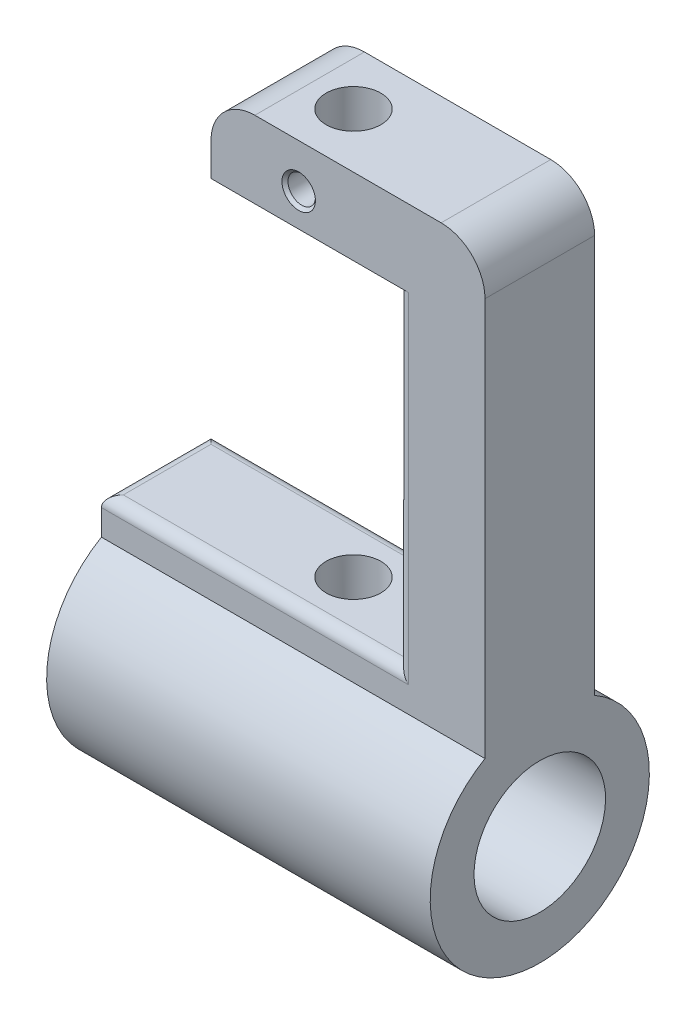
ISO-10303-21;
HEADER;
FILE_DESCRIPTION(('STEP AP214'),'2;1');
FILE_NAME('part.step','',(''),(''),'','','');
FILE_SCHEMA(('AUTOMOTIVE_DESIGN { 1 0 10303 214 1 1 1 1 }'));
ENDSEC;
DATA;
#1=APPLICATION_CONTEXT('core data for automotive mechanical design processes');
#2=APPLICATION_PROTOCOL_DEFINITION('international standard','automotive_design',2000,#1);
#3=PRODUCT_CONTEXT('',#1,'mechanical');
#4=PRODUCT('Part','Part','',(#3));
#5=PRODUCT_RELATED_PRODUCT_CATEGORY('part','',(#4));
#6=PRODUCT_DEFINITION_FORMATION('','',#4);
#7=PRODUCT_DEFINITION_CONTEXT('part definition',#1,'design');
#8=PRODUCT_DEFINITION('design','',#6,#7);
#9=PRODUCT_DEFINITION_SHAPE('','',#8);
#10=(LENGTH_UNIT() NAMED_UNIT(*) SI_UNIT(.MILLI.,.METRE.));
#11=(NAMED_UNIT(*) PLANE_ANGLE_UNIT() SI_UNIT($,.RADIAN.));
#12=(NAMED_UNIT(*) SI_UNIT($,.STERADIAN.) SOLID_ANGLE_UNIT());
#13=UNCERTAINTY_MEASURE_WITH_UNIT(LENGTH_MEASURE(1.E-05),#10,'distance_accuracy_value','');
#14=(GEOMETRIC_REPRESENTATION_CONTEXT(3) GLOBAL_UNCERTAINTY_ASSIGNED_CONTEXT((#13)) GLOBAL_UNIT_ASSIGNED_CONTEXT((#10,
#11,#12)) REPRESENTATION_CONTEXT('',''));
#15=CARTESIAN_POINT('',(0.,0.,0.));
#16=DIRECTION('',(0.,0.,1.));
#17=DIRECTION('',(1.,0.,0.));
#18=AXIS2_PLACEMENT_3D('',#15,#16,#17);
#19=CARTESIAN_POINT('',(-4.,41.,10.));
#20=DIRECTION('',(0.,0.,-1.));
#21=DIRECTION('',(-1.,0.,0.));
#22=AXIS2_PLACEMENT_3D('',#19,#20,#21);
#23=CYLINDRICAL_SURFACE('',#22,4.);
#24=CARTESIAN_POINT('',(-4.,41.,0.));
#25=DIRECTION('',(0.,0.,1.));
#26=DIRECTION('',(-1.,0.,0.));
#27=AXIS2_PLACEMENT_3D('',#24,#25,#26);
#28=CIRCLE('',#27,4.);
#29=CARTESIAN_POINT('',(0.,41.,0.));
#30=VERTEX_POINT('',#29);
#31=CARTESIAN_POINT('',(-4.,45.,0.));
#32=VERTEX_POINT('',#31);
#33=EDGE_CURVE('E296',#30,#32,#28,.T.);
#34=ORIENTED_EDGE('',*,*,#33,.T.);
#35=DIRECTION('',(0.,0.,-1.));
#36=VECTOR('',#35,1.);
#37=CARTESIAN_POINT('',(-4.,45.,10.));
#38=LINE('',#37,#36);
#39=CARTESIAN_POINT('',(-4.,45.,10.));
#40=VERTEX_POINT('',#39);
#41=EDGE_CURVE('E262',#40,#32,#38,.T.);
#42=ORIENTED_EDGE('',*,*,#41,.F.);
#43=CARTESIAN_POINT('',(-4.,41.,10.));
#44=DIRECTION('',(0.,0.,1.));
#45=DIRECTION('',(-1.,0.,0.));
#46=AXIS2_PLACEMENT_3D('',#43,#44,#45);
#47=CIRCLE('',#46,4.);
#48=CARTESIAN_POINT('',(0.,41.,10.));
#49=VERTEX_POINT('',#48);
#50=EDGE_CURVE('E285',#49,#40,#47,.T.);
#51=ORIENTED_EDGE('',*,*,#50,.F.);
#52=DIRECTION('',(0.,0.,-1.));
#53=VECTOR('',#52,1.);
#54=CARTESIAN_POINT('',(0.,41.,10.));
#55=LINE('',#54,#53);
#56=EDGE_CURVE('E279',#49,#30,#55,.T.);
#57=ORIENTED_EDGE('',*,*,#56,.T.);
#58=EDGE_LOOP('',(#34,#42,#51,#57));
#59=FACE_BOUND('',#58,.T.);
#60=ADVANCED_FACE('F42',(#59),#23,.T.);
#61=CARTESIAN_POINT('',(-21.,45.,10.));
#62=DIRECTION('',(0.,-1.,0.));
#63=DIRECTION('',(0.,0.,-1.));
#64=AXIS2_PLACEMENT_3D('',#61,#62,#63);
#65=PLANE('',#64);
#66=CARTESIAN_POINT('',(-17.,45.,5.00000000000001));
#67=DIRECTION('',(0.,1.,0.));
#68=DIRECTION('',(0.,0.,1.));
#69=AXIS2_PLACEMENT_3D('',#66,#67,#68);
#70=CIRCLE('',#69,2.5);
#71=CARTESIAN_POINT('',(-17.,45.,7.50000000000001));
#72=VERTEX_POINT('',#71);
#73=EDGE_CURVE('E225',#72,#72,#70,.T.);
#74=ORIENTED_EDGE('',*,*,#73,.F.);
#75=EDGE_LOOP('',(#74));
#76=FACE_BOUND('',#75,.T.);
#77=DIRECTION('',(-1.,0.,0.));
#78=VECTOR('',#77,1.);
#79=CARTESIAN_POINT('',(-21.,45.,0.));
#80=LINE('',#79,#78);
#81=CARTESIAN_POINT('',(-21.,45.,0.));
#82=VERTEX_POINT('',#81);
#83=EDGE_CURVE('E294',#32,#82,#80,.T.);
#84=ORIENTED_EDGE('',*,*,#83,.T.);
#85=DIRECTION('',(0.,0.,-1.));
#86=VECTOR('',#85,1.);
#87=CARTESIAN_POINT('',(-21.,45.,10.));
#88=LINE('',#87,#86);
#89=CARTESIAN_POINT('',(-21.,45.,10.));
#90=VERTEX_POINT('',#89);
#91=EDGE_CURVE('E265',#90,#82,#88,.T.);
#92=ORIENTED_EDGE('',*,*,#91,.F.);
#93=DIRECTION('',(-1.,0.,0.));
#94=VECTOR('',#93,1.);
#95=CARTESIAN_POINT('',(-21.,45.,10.));
#96=LINE('',#95,#94);
#97=EDGE_CURVE('E308',#40,#90,#96,.T.);
#98=ORIENTED_EDGE('',*,*,#97,.F.);
#99=ORIENTED_EDGE('',*,*,#41,.T.);
#100=EDGE_LOOP('',(#84,#92,#98,#99));
#101=FACE_BOUND('',#100,.T.);
#102=ADVANCED_FACE('F187',(#76,#101),#65,.F.);
#103=CARTESIAN_POINT('',(-21.,41.,10.));
#104=DIRECTION('',(0.,0.,-1.));
#105=DIRECTION('',(-1.,0.,0.));
#106=AXIS2_PLACEMENT_3D('',#103,#104,#105);
#107=CYLINDRICAL_SURFACE('',#106,4.);
#108=CARTESIAN_POINT('',(-21.,41.,0.));
#109=DIRECTION('',(0.,0.,1.));
#110=DIRECTION('',(1.,0.,0.));
#111=AXIS2_PLACEMENT_3D('',#108,#109,#110);
#112=CIRCLE('',#111,4.);
#113=CARTESIAN_POINT('',(-25.,41.,0.));
#114=VERTEX_POINT('',#113);
#115=EDGE_CURVE('E292',#82,#114,#112,.T.);
#116=ORIENTED_EDGE('',*,*,#115,.T.);
#117=DIRECTION('',(0.,0.,-1.));
#118=VECTOR('',#117,1.);
#119=CARTESIAN_POINT('',(-25.,41.,10.));
#120=LINE('',#119,#118);
#121=CARTESIAN_POINT('',(-25.,41.,10.));
#122=VERTEX_POINT('',#121);
#123=EDGE_CURVE('E268',#122,#114,#120,.T.);
#124=ORIENTED_EDGE('',*,*,#123,.F.);
#125=CARTESIAN_POINT('',(-21.,41.,10.));
#126=DIRECTION('',(0.,0.,1.));
#127=DIRECTION('',(1.,0.,0.));
#128=AXIS2_PLACEMENT_3D('',#125,#126,#127);
#129=CIRCLE('',#128,4.);
#130=EDGE_CURVE('E306',#90,#122,#129,.T.);
#131=ORIENTED_EDGE('',*,*,#130,.F.);
#132=ORIENTED_EDGE('',*,*,#91,.T.);
#133=EDGE_LOOP('',(#116,#124,#131,#132));
#134=FACE_BOUND('',#133,.T.);
#135=ADVANCED_FACE('F193',(#134),#107,.T.);
#136=CARTESIAN_POINT('',(-25.,38.,10.));
#137=DIRECTION('',(1.,0.,0.));
#138=DIRECTION('',(0.,0.,-1.));
#139=AXIS2_PLACEMENT_3D('',#136,#137,#138);
#140=PLANE('',#139);
#141=DIRECTION('',(0.,-1.,0.));
#142=VECTOR('',#141,1.);
#143=CARTESIAN_POINT('',(-25.,38.,0.));
#144=LINE('',#143,#142);
#145=CARTESIAN_POINT('',(-25.,38.,0.));
#146=VERTEX_POINT('',#145);
#147=EDGE_CURVE('E290',#114,#146,#144,.T.);
#148=ORIENTED_EDGE('',*,*,#147,.T.);
#149=DIRECTION('',(0.,0.,-1.));
#150=VECTOR('',#149,1.);
#151=CARTESIAN_POINT('',(-25.,38.,10.));
#152=LINE('',#151,#150);
#153=CARTESIAN_POINT('',(-25.,38.,10.));
#154=VERTEX_POINT('',#153);
#155=EDGE_CURVE('E271',#154,#146,#152,.T.);
#156=ORIENTED_EDGE('',*,*,#155,.F.);
#157=DIRECTION('',(0.,-1.,0.));
#158=VECTOR('',#157,1.);
#159=CARTESIAN_POINT('',(-25.,38.,10.));
#160=LINE('',#159,#158);
#161=EDGE_CURVE('E304',#122,#154,#160,.T.);
#162=ORIENTED_EDGE('',*,*,#161,.F.);
#163=ORIENTED_EDGE('',*,*,#123,.T.);
#164=EDGE_LOOP('',(#148,#156,#162,#163));
#165=FACE_BOUND('',#164,.T.);
#166=ADVANCED_FACE('F368',(#165),#140,.F.);
#167=CARTESIAN_POINT('',(-8.,38.,10.));
#168=DIRECTION('',(0.,1.,0.));
#169=DIRECTION('',(-1.,0.,0.));
#170=AXIS2_PLACEMENT_3D('',#167,#168,#169);
#171=PLANE('',#170);
#172=CARTESIAN_POINT('',(-17.,38.,5.00000000000001));
#173=DIRECTION('',(0.,1.,0.));
#174=DIRECTION('',(-1.,0.,0.));
#175=AXIS2_PLACEMENT_3D('',#172,#173,#174);
#176=CIRCLE('',#175,2.5);
#177=CARTESIAN_POINT('',(-19.5,38.,5.00000000000001));
#178=VERTEX_POINT('',#177);
#179=EDGE_CURVE('E259',#178,#178,#176,.T.);
#180=ORIENTED_EDGE('',*,*,#179,.T.);
#181=EDGE_LOOP('',(#180));
#182=FACE_BOUND('',#181,.T.);
#183=DIRECTION('',(1.,0.,0.));
#184=VECTOR('',#183,1.);
#185=CARTESIAN_POINT('',(-8.,38.,0.));
#186=LINE('',#185,#184);
#187=CARTESIAN_POINT('',(-7.,38.,0.));
#188=VERTEX_POINT('',#187);
#189=EDGE_CURVE('E288',#146,#188,#186,.T.);
#190=ORIENTED_EDGE('',*,*,#189,.T.);
#191=CARTESIAN_POINT('',(-7.,38.,0.999999999999999));
#192=DIRECTION('',(0.,1.,0.));
#193=DIRECTION('',(-1.,0.,0.));
#194=AXIS2_PLACEMENT_3D('',#191,#192,#193);
#195=CIRCLE('',#194,1.);
#196=CARTESIAN_POINT('',(-8.,38.,0.999999999999999));
#197=VERTEX_POINT('',#196);
#198=EDGE_CURVE('E56',#188,#197,#195,.T.);
#199=ORIENTED_EDGE('',*,*,#198,.T.);
#200=DIRECTION('',(0.,0.,-1.));
#201=VECTOR('',#200,1.);
#202=CARTESIAN_POINT('',(-8.,38.,10.));
#203=LINE('',#202,#201);
#204=CARTESIAN_POINT('',(-8.,38.,9.));
#205=VERTEX_POINT('',#204);
#206=EDGE_CURVE('E274',#205,#197,#203,.T.);
#207=ORIENTED_EDGE('',*,*,#206,.F.);
#208=CARTESIAN_POINT('',(-7.,38.,9.));
#209=DIRECTION('',(0.,1.,0.));
#210=DIRECTION('',(-1.,0.,0.));
#211=AXIS2_PLACEMENT_3D('',#208,#209,#210);
#212=CIRCLE('',#211,1.);
#213=CARTESIAN_POINT('',(-7.,38.,10.));
#214=VERTEX_POINT('',#213);
#215=EDGE_CURVE('E11',#205,#214,#212,.T.);
#216=ORIENTED_EDGE('',*,*,#215,.T.);
#217=DIRECTION('',(1.,0.,0.));
#218=VECTOR('',#217,1.);
#219=CARTESIAN_POINT('',(-8.,38.,10.));
#220=LINE('',#219,#218);
#221=EDGE_CURVE('E302',#154,#214,#220,.T.);
#222=ORIENTED_EDGE('',*,*,#221,.F.);
#223=ORIENTED_EDGE('',*,*,#155,.T.);
#224=EDGE_LOOP('',(#190,#199,#207,#216,#222,#223));
#225=FACE_BOUND('',#224,.T.);
#226=ADVANCED_FACE('F345',(#182,#225),#171,.F.);
#227=CARTESIAN_POINT('',(-8.,7.99999999999998,10.));
#228=DIRECTION('',(1.,0.,0.));
#229=DIRECTION('',(0.,1.,0.));
#230=AXIS2_PLACEMENT_3D('',#227,#228,#229);
#231=PLANE('',#230);
#232=ORIENTED_EDGE('',*,*,#206,.T.);
#233=DIRECTION('',(0.,-1.,0.));
#234=VECTOR('',#233,1.);
#235=CARTESIAN_POINT('',(-8.,7.99999999999998,0.999999999999999));
#236=LINE('',#235,#234);
#237=CARTESIAN_POINT('',(-8.,7.99999999999998,0.999999999999999));
#238=VERTEX_POINT('',#237);
#239=EDGE_CURVE('E250',#197,#238,#236,.T.);
#240=ORIENTED_EDGE('',*,*,#239,.T.);
#241=DIRECTION('',(0.,0.,-1.));
#242=VECTOR('',#241,1.);
#243=CARTESIAN_POINT('',(-8.,7.99999999999998,10.));
#244=LINE('',#243,#242);
#245=CARTESIAN_POINT('',(-8.,7.99999999999998,9.));
#246=VERTEX_POINT('',#245);
#247=EDGE_CURVE('E277',#246,#238,#244,.T.);
#248=ORIENTED_EDGE('',*,*,#247,.F.);
#249=DIRECTION('',(0.,-1.,0.));
#250=VECTOR('',#249,1.);
#251=CARTESIAN_POINT('',(-8.,7.99999999999998,9.));
#252=LINE('',#251,#250);
#253=EDGE_CURVE('E253',#246,#205,#252,.F.);
#254=ORIENTED_EDGE('',*,*,#253,.T.);
#255=EDGE_LOOP('',(#232,#240,#248,#254));
#256=FACE_BOUND('',#255,.T.);
#257=ADVANCED_FACE('F348',(#256),#231,.F.);
#258=CARTESIAN_POINT('',(-35.,7.99999999999998,10.));
#259=DIRECTION('',(0.,-1.,0.));
#260=DIRECTION('',(0.,0.,-1.));
#261=AXIS2_PLACEMENT_3D('',#258,#259,#260);
#262=PLANE('',#261);
#263=ORIENTED_EDGE('',*,*,#247,.T.);
#264=DIRECTION('',(-1.,0.,0.));
#265=VECTOR('',#264,1.);
#266=CARTESIAN_POINT('',(-35.,7.99999999999998,0.999999999999999));
#267=LINE('',#266,#265);
#268=CARTESIAN_POINT('',(-34.,7.99999999999998,0.999999999999999));
#269=VERTEX_POINT('',#268);
#270=EDGE_CURVE('E69',#238,#269,#267,.T.);
#271=ORIENTED_EDGE('',*,*,#270,.T.);
#272=DIRECTION('',(0.,0.,-1.));
#273=VECTOR('',#272,1.);
#274=CARTESIAN_POINT('',(-34.,7.99999999999998,10.));
#275=LINE('',#274,#273);
#276=CARTESIAN_POINT('',(-34.,7.99999999999998,9.));
#277=VERTEX_POINT('',#276);
#278=EDGE_CURVE('E64',#269,#277,#275,.F.);
#279=ORIENTED_EDGE('',*,*,#278,.T.);
#280=DIRECTION('',(-1.,0.,0.));
#281=VECTOR('',#280,1.);
#282=CARTESIAN_POINT('',(-35.,7.99999999999998,9.));
#283=LINE('',#282,#281);
#284=EDGE_CURVE('E220',#277,#246,#283,.F.);
#285=ORIENTED_EDGE('',*,*,#284,.T.);
#286=EDGE_LOOP('',(#263,#271,#279,#285));
#287=FACE_BOUND('',#286,.T.);
#288=CARTESIAN_POINT('',(-17.,7.99999999999998,5.00000000000001));
#289=DIRECTION('',(0.,-1.,0.));
#290=DIRECTION('',(0.,0.,-1.));
#291=AXIS2_PLACEMENT_3D('',#288,#289,#290);
#292=CIRCLE('',#291,2.5);
#293=CARTESIAN_POINT('',(-17.,7.99999999999998,2.50000000000001));
#294=VERTEX_POINT('',#293);
#295=EDGE_CURVE('E256',#294,#294,#292,.T.);
#296=ORIENTED_EDGE('',*,*,#295,.T.);
#297=EDGE_LOOP('',(#296));
#298=FACE_BOUND('',#297,.T.);
#299=ADVANCED_FACE('F350',(#287,#298),#262,.F.);
#300=CARTESIAN_POINT('',(-35.,0.,10.));
#301=DIRECTION('',(1.,0.,0.));
#302=DIRECTION('',(0.,0.,-1.));
#303=AXIS2_PLACEMENT_3D('',#300,#301,#302);
#304=PLANE('',#303);
#305=CARTESIAN_POINT('',(-35.,-4.00000000000001,5.));
#306=DIRECTION('',(1.,0.,0.));
#307=DIRECTION('',(0.,1.,0.));
#308=AXIS2_PLACEMENT_3D('',#305,#306,#307);
#309=CIRCLE('',#308,6.);
#310=CARTESIAN_POINT('',(-35.,1.99999999999999,5.));
#311=VERTEX_POINT('',#310);
#312=EDGE_CURVE('E317',#311,#311,#309,.T.);
#313=ORIENTED_EDGE('',*,*,#312,.T.);
#314=EDGE_LOOP('',(#313));
#315=FACE_BOUND('',#314,.T.);
#316=DIRECTION('',(0.,-1.,0.));
#317=VECTOR('',#316,1.);
#318=CARTESIAN_POINT('',(-35.,0.,10.));
#319=LINE('',#318,#317);
#320=CARTESIAN_POINT('',(-35.,6.99999999999998,10.));
#321=VERTEX_POINT('',#320);
#322=CARTESIAN_POINT('',(-35.,4.66025403784439,10.));
#323=VERTEX_POINT('',#322);
#324=EDGE_CURVE('E300',#321,#323,#319,.T.);
#325=ORIENTED_EDGE('',*,*,#324,.F.);
#326=DIRECTION('',(0.,0.,-1.));
#327=VECTOR('',#326,1.);
#328=CARTESIAN_POINT('',(-35.,6.99999999999998,10.));
#329=LINE('',#328,#327);
#330=CARTESIAN_POINT('',(-35.,6.99999999999998,0.));
#331=VERTEX_POINT('',#330);
#332=EDGE_CURVE('E237',#321,#331,#329,.T.);
#333=ORIENTED_EDGE('',*,*,#332,.T.);
#334=DIRECTION('',(0.,-1.,0.));
#335=VECTOR('',#334,1.);
#336=CARTESIAN_POINT('',(-35.,0.,0.));
#337=LINE('',#336,#335);
#338=CARTESIAN_POINT('',(-35.,4.66025403784439,0.));
#339=VERTEX_POINT('',#338);
#340=EDGE_CURVE('E286',#331,#339,#337,.T.);
#341=ORIENTED_EDGE('',*,*,#340,.T.);
#342=CARTESIAN_POINT('',(-35.,-4.,5.));
#343=DIRECTION('',(1.,0.,0.));
#344=DIRECTION('',(0.,1.,0.));
#345=AXIS2_PLACEMENT_3D('',#342,#343,#344);
#346=CIRCLE('',#345,10.);
#347=EDGE_CURVE('E314',#323,#339,#346,.T.);
#348=ORIENTED_EDGE('',*,*,#347,.F.);
#349=EDGE_LOOP('',(#325,#333,#341,#348));
#350=FACE_BOUND('',#349,.T.);
#351=ADVANCED_FACE('F353',(#315,#350),#304,.F.);
#352=CARTESIAN_POINT('',(0.,41.,10.));
#353=DIRECTION('',(-1.,0.,0.));
#354=DIRECTION('',(0.,-1.,0.));
#355=AXIS2_PLACEMENT_3D('',#352,#353,#354);
#356=PLANE('',#355);
#357=CARTESIAN_POINT('',(0.,-4.,5.));
#358=DIRECTION('',(1.,0.,0.));
#359=DIRECTION('',(0.,1.,0.));
#360=AXIS2_PLACEMENT_3D('',#357,#358,#359);
#361=CIRCLE('',#360,6.);
#362=CARTESIAN_POINT('',(0.,2.,5.));
#363=VERTEX_POINT('',#362);
#364=EDGE_CURVE('E320',#363,#363,#361,.T.);
#365=ORIENTED_EDGE('',*,*,#364,.F.);
#366=EDGE_LOOP('',(#365));
#367=FACE_BOUND('',#366,.T.);
#368=DIRECTION('',(0.,1.,0.));
#369=VECTOR('',#368,1.);
#370=CARTESIAN_POINT('',(0.,41.,10.));
#371=LINE('',#370,#369);
#372=CARTESIAN_POINT('',(0.,4.6602540378444,10.));
#373=VERTEX_POINT('',#372);
#374=EDGE_CURVE('E282',#373,#49,#371,.T.);
#375=ORIENTED_EDGE('',*,*,#374,.F.);
#376=CARTESIAN_POINT('',(0.,-4.,5.));
#377=DIRECTION('',(1.,0.,0.));
#378=DIRECTION('',(0.,1.,0.));
#379=AXIS2_PLACEMENT_3D('',#376,#377,#378);
#380=CIRCLE('',#379,10.);
#381=CARTESIAN_POINT('',(0.,4.66025403784441,0.));
#382=VERTEX_POINT('',#381);
#383=EDGE_CURVE('E315',#373,#382,#380,.T.);
#384=ORIENTED_EDGE('',*,*,#383,.T.);
#385=DIRECTION('',(0.,1.,0.));
#386=VECTOR('',#385,1.);
#387=CARTESIAN_POINT('',(0.,41.,0.));
#388=LINE('',#387,#386);
#389=EDGE_CURVE('E283',#382,#30,#388,.T.);
#390=ORIENTED_EDGE('',*,*,#389,.T.);
#391=ORIENTED_EDGE('',*,*,#56,.F.);
#392=EDGE_LOOP('',(#375,#384,#390,#391));
#393=FACE_BOUND('',#392,.T.);
#394=ADVANCED_FACE('F337',(#367,#393),#356,.F.);
#395=CARTESIAN_POINT('',(-4.,41.,10.));
#396=DIRECTION('',(0.,0.,-1.));
#397=DIRECTION('',(-1.,0.,0.));
#398=AXIS2_PLACEMENT_3D('',#395,#396,#397);
#399=PLANE('',#398);
#400=CARTESIAN_POINT('',(-17.,41.,10.));
#401=DIRECTION('',(0.,0.,1.));
#402=DIRECTION('',(1.,0.,0.));
#403=AXIS2_PLACEMENT_3D('',#400,#401,#402);
#404=CIRCLE('',#403,1.525);
#405=CARTESIAN_POINT('',(-15.475,41.,10.));
#406=VERTEX_POINT('',#405);
#407=EDGE_CURVE('E158',#406,#406,#404,.T.);
#408=ORIENTED_EDGE('',*,*,#407,.F.);
#409=EDGE_LOOP('',(#408));
#410=FACE_BOUND('',#409,.T.);
#411=ORIENTED_EDGE('',*,*,#221,.T.);
#412=DIRECTION('',(0.,-1.,0.));
#413=VECTOR('',#412,1.);
#414=CARTESIAN_POINT('',(-7.,41.,10.));
#415=LINE('',#414,#413);
#416=CARTESIAN_POINT('',(-7.,6.99999999999999,10.));
#417=VERTEX_POINT('',#416);
#418=EDGE_CURVE('E242',#214,#417,#415,.T.);
#419=ORIENTED_EDGE('',*,*,#418,.T.);
#420=DIRECTION('',(-1.,0.,0.));
#421=VECTOR('',#420,1.);
#422=CARTESIAN_POINT('',(-4.,6.99999999999999,10.));
#423=LINE('',#422,#421);
#424=EDGE_CURVE('E222',#417,#321,#423,.T.);
#425=ORIENTED_EDGE('',*,*,#424,.T.);
#426=ORIENTED_EDGE('',*,*,#324,.T.);
#427=DIRECTION('',(1.,0.,0.));
#428=VECTOR('',#427,1.);
#429=CARTESIAN_POINT('',(-35.,4.66025403784439,10.));
#430=LINE('',#429,#428);
#431=EDGE_CURVE('E298',#323,#373,#430,.T.);
#432=ORIENTED_EDGE('',*,*,#431,.T.);
#433=ORIENTED_EDGE('',*,*,#374,.T.);
#434=ORIENTED_EDGE('',*,*,#50,.T.);
#435=ORIENTED_EDGE('',*,*,#97,.T.);
#436=ORIENTED_EDGE('',*,*,#130,.T.);
#437=ORIENTED_EDGE('',*,*,#161,.T.);
#438=EDGE_LOOP('',(#411,#419,#425,#426,#432,#433,#434,#435,#436,#437));
#439=FACE_BOUND('',#438,.T.);
#440=ADVANCED_FACE('F333',(#410,#439),#399,.F.);
#441=CARTESIAN_POINT('',(-4.,41.,0.));
#442=DIRECTION('',(0.,0.,-1.));
#443=DIRECTION('',(-1.,0.,0.));
#444=AXIS2_PLACEMENT_3D('',#441,#442,#443);
#445=PLANE('',#444);
#446=DIRECTION('',(0.,-1.,0.));
#447=VECTOR('',#446,1.);
#448=CARTESIAN_POINT('',(-7.,38.,0.));
#449=LINE('',#448,#447);
#450=CARTESIAN_POINT('',(-7.,6.99999999999998,0.));
#451=VERTEX_POINT('',#450);
#452=EDGE_CURVE('E245',#451,#188,#449,.F.);
#453=ORIENTED_EDGE('',*,*,#452,.T.);
#454=ORIENTED_EDGE('',*,*,#189,.F.);
#455=ORIENTED_EDGE('',*,*,#147,.F.);
#456=ORIENTED_EDGE('',*,*,#115,.F.);
#457=ORIENTED_EDGE('',*,*,#83,.F.);
#458=ORIENTED_EDGE('',*,*,#33,.F.);
#459=ORIENTED_EDGE('',*,*,#389,.F.);
#460=DIRECTION('',(1.,0.,0.));
#461=VECTOR('',#460,1.);
#462=CARTESIAN_POINT('',(-35.,4.66025403784439,0.));
#463=LINE('',#462,#461);
#464=EDGE_CURVE('E255',#339,#382,#463,.T.);
#465=ORIENTED_EDGE('',*,*,#464,.F.);
#466=ORIENTED_EDGE('',*,*,#340,.F.);
#467=DIRECTION('',(-1.,0.,0.));
#468=VECTOR('',#467,1.);
#469=CARTESIAN_POINT('',(-8.,6.99999999999998,0.));
#470=LINE('',#469,#468);
#471=EDGE_CURVE('E248',#331,#451,#470,.F.);
#472=ORIENTED_EDGE('',*,*,#471,.T.);
#473=EDGE_LOOP('',(#453,#454,#455,#456,#457,#458,#459,#465,#466,#472));
#474=FACE_BOUND('',#473,.T.);
#475=ADVANCED_FACE('F336',(#474),#445,.T.);
#476=CARTESIAN_POINT('',(-35.,-4.,5.));
#477=DIRECTION('',(1.,0.,0.));
#478=DIRECTION('',(0.,1.,0.));
#479=AXIS2_PLACEMENT_3D('',#476,#477,#478);
#480=CYLINDRICAL_SURFACE('',#479,10.);
#481=ORIENTED_EDGE('',*,*,#431,.F.);
#482=ORIENTED_EDGE('',*,*,#347,.T.);
#483=ORIENTED_EDGE('',*,*,#464,.T.);
#484=ORIENTED_EDGE('',*,*,#383,.F.);
#485=EDGE_LOOP('',(#481,#482,#483,#484));
#486=FACE_BOUND('',#485,.T.);
#487=ADVANCED_FACE('F183',(#486),#480,.T.);
#488=CARTESIAN_POINT('',(-35.,-4.00000000000001,5.));
#489=DIRECTION('',(1.,0.,0.));
#490=DIRECTION('',(0.,1.,0.));
#491=AXIS2_PLACEMENT_3D('',#488,#489,#490);
#492=CYLINDRICAL_SURFACE('',#491,6.);
#493=ORIENTED_EDGE('',*,*,#312,.F.);
#494=EDGE_LOOP('',(#493));
#495=FACE_BOUND('',#494,.T.);
#496=ORIENTED_EDGE('',*,*,#364,.T.);
#497=EDGE_LOOP('',(#496));
#498=FACE_BOUND('',#497,.T.);
#499=ADVANCED_FACE('F176',(#495,#498),#492,.F.);
#500=CARTESIAN_POINT('',(-17.,3.99999999999996,5.00000000000001));
#501=DIRECTION('',(0.,1.,0.));
#502=DIRECTION('',(0.,0.,1.));
#503=AXIS2_PLACEMENT_3D('',#500,#501,#502);
#504=PLANE('',#503);
#505=CARTESIAN_POINT('',(-17.,3.99999999999996,5.00000000000001));
#506=DIRECTION('',(0.,1.,0.));
#507=DIRECTION('',(0.,0.,1.));
#508=AXIS2_PLACEMENT_3D('',#505,#506,#507);
#509=CIRCLE('',#508,2.5);
#510=CARTESIAN_POINT('',(-17.,3.99999999999996,7.50000000000001));
#511=VERTEX_POINT('',#510);
#512=EDGE_CURVE('E228',#511,#511,#509,.T.);
#513=ORIENTED_EDGE('',*,*,#512,.T.);
#514=EDGE_LOOP('',(#513));
#515=FACE_BOUND('',#514,.T.);
#516=ADVANCED_FACE('F173',(#515),#504,.T.);
#517=CARTESIAN_POINT('',(-17.,3.99999999999996,5.00000000000001));
#518=DIRECTION('',(0.,1.,0.));
#519=DIRECTION('',(0.,0.,1.));
#520=AXIS2_PLACEMENT_3D('',#517,#518,#519);
#521=CYLINDRICAL_SURFACE('',#520,2.5);
#522=ORIENTED_EDGE('',*,*,#512,.F.);
#523=EDGE_LOOP('',(#522));
#524=FACE_BOUND('',#523,.T.);
#525=ORIENTED_EDGE('',*,*,#295,.F.);
#526=EDGE_LOOP('',(#525));
#527=FACE_BOUND('',#526,.T.);
#528=ADVANCED_FACE('F175',(#524,#527),#521,.F.);
#529=CARTESIAN_POINT('',(-17.,39.75,7.50000000000001));
#530=CARTESIAN_POINT('',(-16.9342850463088,39.7500041278994,7.49999641755189));
#531=CARTESIAN_POINT('',(-16.8684917503775,39.7552125914021,7.49738113774398));
#532=CARTESIAN_POINT('',(-16.7388497059145,39.7758161004261,7.48717695046746));
#533=CARTESIAN_POINT('',(-16.6750048916081,39.791230491247,7.4795785978623));
#534=CARTESIAN_POINT('',(-16.5513330688993,39.831492260771,7.4602034925414));
#535=CARTESIAN_POINT('',(-16.491491496326,39.85630298031,7.44844298971901));
#536=CARTESIAN_POINT('',(-16.3769092289918,39.9144632767062,7.42182220644724));
#537=CARTESIAN_POINT('',(-16.3221681325124,39.9478121803111,7.40696217041913));
#538=CARTESIAN_POINT('',(-16.2156152277976,40.0243965618566,7.37445322822572));
#539=CARTESIAN_POINT('',(-16.1641809860974,40.0681080990495,7.35668998909421));
#540=CARTESIAN_POINT('',(-16.0690256939163,40.1631518490588,7.32074962808431));
#541=CARTESIAN_POINT('',(-16.0253105211166,40.2144898147155,7.30257220261295));
#542=CARTESIAN_POINT('',(-15.9434349994372,40.3281041869042,7.26623688996685));
#543=CARTESIAN_POINT('',(-15.9059683305605,40.3909201229324,7.24818983712666));
#544=CARTESIAN_POINT('',(-15.8422897163866,40.5229591699828,7.21607473465402));
#545=CARTESIAN_POINT('',(-15.8160697312921,40.5921776609034,7.20200384508738));
#546=CARTESIAN_POINT('',(-15.7773344472643,40.7308313817774,7.18072333797262));
#547=CARTESIAN_POINT('',(-15.7640926786495,40.8000055650842,7.17315339479643));
#548=CARTESIAN_POINT('',(-15.749466258364,40.9399735472243,7.16477362435661));
#549=CARTESIAN_POINT('',(-15.7480698895337,41.0107656760889,7.16395711679112));
#550=CARTESIAN_POINT('',(-15.7566408910346,41.1428575303942,7.16888662821562));
#551=CARTESIAN_POINT('',(-15.765269300579,41.2042800390288,7.17385954577519));
#552=CARTESIAN_POINT('',(-15.7913251886789,41.3246523867163,7.18845285917315));
#553=CARTESIAN_POINT('',(-15.808755470128,41.3836014316316,7.19807473539722));
#554=CARTESIAN_POINT('',(-15.8522377745175,41.499036415707,7.22109345515928));
#555=CARTESIAN_POINT('',(-15.878481166105,41.5554329984822,7.2345730083));
#556=CARTESIAN_POINT('',(-15.938697890415,41.6632928657375,7.26379255351756));
#557=CARTESIAN_POINT('',(-15.9726746952344,41.7147539195001,7.2795335597524));
#558=CARTESIAN_POINT('',(-16.052417431359,41.818151565929,7.31391447379109));
#559=CARTESIAN_POINT('',(-16.0991319270384,41.8693210919702,7.33266887795934));
#560=CARTESIAN_POINT('',(-16.2005555265733,41.9634192732386,7.36934529125511));
#561=CARTESIAN_POINT('',(-16.2552684292822,42.0063439900423,7.38726689948502));
#562=CARTESIAN_POINT('',(-16.3743543677102,42.0846070762871,7.42127484103706));
#563=CARTESIAN_POINT('',(-16.4390580105008,42.1195005905571,7.4372373020251));
#564=CARTESIAN_POINT('',(-16.574417230639,42.1776212863037,7.46447351401554));
#565=CARTESIAN_POINT('',(-16.6450680296684,42.2008577312689,7.47575098679442));
#566=CARTESIAN_POINT('',(-16.7840418854241,42.2330942546458,7.49155417176796));
#567=CARTESIAN_POINT('',(-16.8520730868146,42.2431140446834,7.4965617287664));
#568=CARTESIAN_POINT('',(-16.9890255000633,42.2518309139181,7.50091266823878));
#569=CARTESIAN_POINT('',(-17.0579462748374,42.2505333570493,7.50025873401641));
#570=CARTESIAN_POINT('',(-17.1890412149825,42.2372416394765,7.49363990316801));
#571=CARTESIAN_POINT('',(-17.2513242600625,42.2260843340874,7.48809057110238));
#572=CARTESIAN_POINT('',(-17.3730086153774,42.1947024101311,7.47277714143524));
#573=CARTESIAN_POINT('',(-17.4324096071138,42.1744767919333,7.46301257917916));
#574=CARTESIAN_POINT('',(-17.5486107605621,42.1250019169585,7.43980314267087));
#575=CARTESIAN_POINT('',(-17.6052879962577,42.0955111873539,7.42626102212424));
#576=CARTESIAN_POINT('',(-17.7130767021237,42.0286155804424,7.39679967896386));
#577=CARTESIAN_POINT('',(-17.7641857872191,41.9912073317582,7.38087944457232));
#578=CARTESIAN_POINT('',(-17.8647096116133,41.9052994683339,7.34635276671831));
#579=CARTESIAN_POINT('',(-17.9134650972808,41.856071414433,7.32763606060552));
#580=CARTESIAN_POINT('',(-18.0023204013916,41.7500935609133,7.29077989504843));
#581=CARTESIAN_POINT('',(-18.0424142321136,41.6933386014795,7.27264084226908));
#582=CARTESIAN_POINT('',(-18.1146348931221,41.5704454322496,7.23813990282585));
#583=CARTESIAN_POINT('',(-18.1462818698483,41.5039859172392,7.2219066207934));
#584=CARTESIAN_POINT('',(-18.1976035325173,41.3656124153843,7.19467590460158));
#585=CARTESIAN_POINT('',(-18.2172936448595,41.2937055918735,7.18367172800773));
#586=CARTESIAN_POINT('',(-18.2423271093121,41.1538622214231,7.16951876260834));
#587=CARTESIAN_POINT('',(-18.2488662455011,41.0862071832137,7.16571729325614));
#588=CARTESIAN_POINT('',(-18.250861442976,40.9506911660365,7.16456693307719));
#589=CARTESIAN_POINT('',(-18.2463223082805,40.8828302890757,7.16721524534441));
#590=CARTESIAN_POINT('',(-18.2274076569903,40.7556456230849,7.17797327562532));
#591=CARTESIAN_POINT('',(-18.2140103929285,40.6961244123195,7.18553868102993));
#592=CARTESIAN_POINT('',(-18.1789691977808,40.5802398507191,7.20463770234898));
#593=CARTESIAN_POINT('',(-18.1573226139498,40.523877522385,7.21617259462095));
#594=CARTESIAN_POINT('',(-18.1047696816259,40.4117189362667,7.24285662955661));
#595=CARTESIAN_POINT('',(-18.0733389222706,40.3562151227128,7.25819652995239));
#596=CARTESIAN_POINT('',(-18.0026887145458,40.2509068297742,7.29044164543239));
#597=CARTESIAN_POINT('',(-17.9634652140483,40.2011053368519,7.30734767243153));
#598=CARTESIAN_POINT('',(-17.8727541583308,40.1023225220529,7.34327903949142));
#599=CARTESIAN_POINT('',(-17.8203555287627,40.0541761220476,7.36231229139337));
#600=CARTESIAN_POINT('',(-17.7076935077753,39.9671712707204,7.3984719031886));
#601=CARTESIAN_POINT('',(-17.647425904071,39.9283178257171,7.41559723260051));
#602=CARTESIAN_POINT('',(-17.5199144960249,39.8609545465472,7.4462251198138));
#603=CARTESIAN_POINT('',(-17.4526243799183,39.8325197882357,7.45970120703637));
#604=CARTESIAN_POINT('',(-17.3134276266177,39.7877397901013,7.48126676704333));
#605=CARTESIAN_POINT('',(-17.241534749529,39.771360191463,7.48937154216166));
#606=CARTESIAN_POINT('',(-17.1407524331042,39.7576282361552,7.4961932738708));
#607=CARTESIAN_POINT('',(-17.1127023492994,39.7547716989205,7.49761706674003));
#608=CARTESIAN_POINT('',(-17.0564396647589,39.750956668104,7.49952121222332));
#609=CARTESIAN_POINT('',(-17.0282270595592,39.749998226911,7.50000153879705));
#610=CARTESIAN_POINT('',(-17.,39.75,7.50000000000001));
#611=B_SPLINE_CURVE_WITH_KNOTS('',3,(#529,#530,#531,#532,#533,#534,#535,#536,#537,#538,#539,
#540,#541,#542,#543,#544,#545,#546,#547,#548,#549,#550,#551,#552,#553,#554,#555,#556,#557,#558,
#559,#560,#561,#562,#563,#564,#565,#566,#567,#568,#569,#570,#571,#572,#573,#574,#575,#576,#577,
#578,#579,#580,#581,#582,#583,#584,#585,#586,#587,#588,#589,#590,#591,#592,#593,#594,#595,#596,
#597,#598,#599,#600,#601,#602,#603,#604,#605,#606,#607,#608,#609,#610),.UNSPECIFIED.,.T.,.F.,(4,
2,2,2,2,2,2,2,2,2,2,2,2,2,2,2,2,2,2,2,2,2,2,2,2,2,2,2,2,2,2,2,2,2,2,2,2,2,2,2,4),(0.,
0.197030321775363,0.394435187136494,0.59107769436537,0.787704700726955,0.996227198397602,
1.20490779706753,1.42977158038439,1.6544743487285,1.86572515175286,2.07676696661274,
2.26257140511649,2.44843504907095,2.63862800210608,2.82890651575276,3.04331176667347,
3.25781918248355,3.48228777768048,3.70657771140347,3.91229113089179,4.11790705639342,
4.30758633132649,4.49728652038661,4.6924107003487,4.88761813435421,5.10199513305521,
5.31651985769286,5.54143352699589,5.76605639925968,5.96911634372963,6.17208824825003,
6.35572412805224,6.53941910979593,6.73545570969513,6.93159451423693,7.15156553440619,
7.37165479220712,7.59330017078652,7.81431135781158,7.89894100172117,7.98357298143554),.UNSPECIFIED.);
#612=CARTESIAN_POINT('',(-17.,39.75,7.50000000000001));
#613=VERTEX_POINT('',#612);
#614=EDGE_CURVE('E46',#613,#613,#611,.T.);
#615=ORIENTED_EDGE('',*,*,#614,.T.);
#616=EDGE_LOOP('',(#615));
#617=FACE_BOUND('',#616,.T.);
#618=CARTESIAN_POINT('',(-17.5025364985941,41.0158825832395,2.55102938613369));
#619=CARTESIAN_POINT('',(-17.501608751922,41.0351680847767,2.55083878343187));
#620=CARTESIAN_POINT('',(-17.4989862706678,41.0543847466289,2.55029959130958));
#621=CARTESIAN_POINT('',(-17.4905410119934,41.0920831503092,2.54859484237114));
#622=CARTESIAN_POINT('',(-17.484713168309,41.1105636789169,2.54742829404654));
#623=CARTESIAN_POINT('',(-17.4702799561469,41.146225820217,2.54462018423395));
#624=CARTESIAN_POINT('',(-17.4616912347517,41.1634144747741,2.54298147568845));
#625=CARTESIAN_POINT('',(-17.4421539788085,41.1963418648352,2.53939065808653));
#626=CARTESIAN_POINT('',(-17.4312052168583,41.2120804604098,2.53743851883407));
#627=CARTESIAN_POINT('',(-17.4054830351785,41.2442904228454,2.53306290956684));
#628=CARTESIAN_POINT('',(-17.3903794962812,41.2604938841655,2.53061339300247));
#629=CARTESIAN_POINT('',(-17.3580690661754,41.2906442106133,2.52572149394));
#630=CARTESIAN_POINT('',(-17.3408607515513,41.304589533632,2.52327911742634));
#631=CARTESIAN_POINT('',(-17.3011239800229,41.332723631055,2.51810528659165));
#632=CARTESIAN_POINT('',(-17.278222442878,41.3463944774152,2.5154148489103));
#633=CARTESIAN_POINT('',(-17.2306216109962,41.3702547671496,2.51054476823945));
#634=CARTESIAN_POINT('',(-17.2059212909082,41.3804422057523,2.5083654196179));
#635=CARTESIAN_POINT('',(-17.1519144930001,41.3983463258111,2.50445457390189));
#636=CARTESIAN_POINT('',(-17.1224315732118,41.4055561691641,2.50282079921216));
#637=CARTESIAN_POINT('',(-17.0626625055385,41.4152574354396,2.50060635709876));
#638=CARTESIAN_POINT('',(-17.0323762272291,41.417748087393,2.50002586174884));
#639=CARTESIAN_POINT('',(-16.9704963347851,41.4179695646398,2.49997480656154));
#640=CARTESIAN_POINT('',(-16.9389016972154,41.4154942529306,2.50055231491501));
#641=CARTESIAN_POINT('',(-16.8765705846522,41.4054111276442,2.50285389312601));
#642=CARTESIAN_POINT('',(-16.8458344883059,41.3978010855597,2.50457846081038));
#643=CARTESIAN_POINT('',(-16.7860754560279,41.377563024856,2.50898897522365));
#644=CARTESIAN_POINT('',(-16.7570553459383,41.364926980139,2.51167645896317));
#645=CARTESIAN_POINT('',(-16.7017189941361,41.3348005902863,2.51770237392739));
#646=CARTESIAN_POINT('',(-16.6754010551322,41.3173133181846,2.52104039267057));
#647=CARTESIAN_POINT('',(-16.6318651371177,41.2819881340215,2.52717737527311));
#648=CARTESIAN_POINT('',(-16.6139111090943,41.2650475642416,2.52993638255741));
#649=CARTESIAN_POINT('',(-16.5810001538238,41.2284488766523,2.53530606233683));
#650=CARTESIAN_POINT('',(-16.5660390254033,41.2087946345479,2.53791693902141));
#651=CARTESIAN_POINT('',(-16.5422759203299,41.1708141193554,2.54223518565314));
#652=CARTESIAN_POINT('',(-16.53284965573,41.1528884754847,2.54402057563583));
#653=CARTESIAN_POINT('',(-16.5170474439749,41.1156926867782,2.54707888775339));
#654=CARTESIAN_POINT('',(-16.5106692563404,41.0964235414543,2.54835218619007));
#655=CARTESIAN_POINT('',(-16.5013775737159,41.0569016237524,2.55022469969297));
#656=CARTESIAN_POINT('',(-16.4984847149702,41.0366437246027,2.55081989869064));
#657=CARTESIAN_POINT('',(-16.4964818242206,40.9959345511901,2.55123076077242));
#658=CARTESIAN_POINT('',(-16.4973705922149,40.9754833403249,2.5510466711438));
#659=CARTESIAN_POINT('',(-16.5025797966319,40.9370704465671,2.54998394468279));
#660=CARTESIAN_POINT('',(-16.5065604641958,40.9190591072787,2.54917411411046));
#661=CARTESIAN_POINT('',(-16.5172752873325,40.883912300802,2.54704129028061));
#662=CARTESIAN_POINT('',(-16.5240101750583,40.8667770678722,2.54571816057785));
#663=CARTESIAN_POINT('',(-16.5403453372086,40.8327247615375,2.54260498030127));
#664=CARTESIAN_POINT('',(-16.5500913309489,40.8158803216436,2.54079197135496));
#665=CARTESIAN_POINT('',(-16.5718334154296,40.7837524689098,2.5369134571111));
#666=CARTESIAN_POINT('',(-16.5838305556345,40.7684697893022,2.53484783420425));
#667=CARTESIAN_POINT('',(-16.6120807101591,40.7369130986364,2.53023099451786));
#668=CARTESIAN_POINT('',(-16.6287104290856,40.7209794970484,2.52766068403106));
#669=CARTESIAN_POINT('',(-16.6640412391975,40.6915897510953,2.52261207112372));
#670=CARTESIAN_POINT('',(-16.6827437517126,40.6781353237621,2.5201338334125));
#671=CARTESIAN_POINT('',(-16.7255546755563,40.6514265878746,2.51499927999631));
#672=CARTESIAN_POINT('',(-16.750009195702,40.6387137864209,2.51240115547139));
#673=CARTESIAN_POINT('',(-16.8005852761577,40.6170460730206,2.50783633288151));
#674=CARTESIAN_POINT('',(-16.8267076482454,40.6080930073269,2.50586994514785));
#675=CARTESIAN_POINT('',(-16.8830331527386,40.5932592088441,2.50256133707821));
#676=CARTESIAN_POINT('',(-16.9133642563475,40.5878388448847,2.5013145202443));
#677=CARTESIAN_POINT('',(-16.9745259598492,40.5818833333973,2.49994249810834));
#678=CARTESIAN_POINT('',(-17.0053566208975,40.5813487885836,2.4998174311853));
#679=CARTESIAN_POINT('',(-17.0676130829932,40.5852324519514,2.50071497524421));
#680=CARTESIAN_POINT('',(-17.0990293084594,40.5897984532403,2.50177183468147));
#681=CARTESIAN_POINT('',(-17.1606439903478,40.6040410756362,2.50497574043832));
#682=CARTESIAN_POINT('',(-17.1908417813636,40.6137204496406,2.50712337397624));
#683=CARTESIAN_POINT('',(-17.2489989927982,40.637995048209,2.51226018836194));
#684=CARTESIAN_POINT('',(-17.2769657125873,40.6525733538524,2.51524646711581));
#685=CARTESIAN_POINT('',(-17.3297945050391,40.6864841730811,2.5217058762642));
#686=CARTESIAN_POINT('',(-17.3546598254378,40.7058116493134,2.52517848914603));
#687=CARTESIAN_POINT('',(-17.3942841585126,40.7434666439065,2.53122808898091));
#688=CARTESIAN_POINT('',(-17.4100022148283,40.7607882780621,2.53380724789876));
#689=CARTESIAN_POINT('',(-17.4384298732608,40.7977852654881,2.53870221490135));
#690=CARTESIAN_POINT('',(-17.4511432228879,40.8174576402586,2.54101834913988));
#691=CARTESIAN_POINT('',(-17.4710582039261,40.8554492570149,2.54476273756392));
#692=CARTESIAN_POINT('',(-17.4788206287596,40.8734657751112,2.54627419477743));
#693=CARTESIAN_POINT('',(-17.4912727551326,40.9105553496404,2.54873662725794));
#694=CARTESIAN_POINT('',(-17.4959685415125,40.9296262318955,2.54968871205542));
#695=CARTESIAN_POINT('',(-17.5006862857556,40.9600116481789,2.55064991424485));
#696=CARTESIAN_POINT('',(-17.5018484903775,40.9711518803478,2.55088822302196));
#697=CARTESIAN_POINT('',(-17.5030425999374,40.99349664525,2.55113322480415));
#698=CARTESIAN_POINT('',(-17.5030743900013,41.0047011844025,2.55113989426977));
#699=CARTESIAN_POINT('',(-17.5025364985941,41.0158825832395,2.55102938613369));
#700=B_SPLINE_CURVE_WITH_KNOTS('',3,(#618,#619,#620,#621,#622,#623,#624,#625,#626,#627,#628,
#629,#630,#631,#632,#633,#634,#635,#636,#637,#638,#639,#640,#641,#642,#643,#644,#645,#646,#647,
#648,#649,#650,#651,#652,#653,#654,#655,#656,#657,#658,#659,#660,#661,#662,#663,#664,#665,#666,
#667,#668,#669,#670,#671,#672,#673,#674,#675,#676,#677,#678,#679,#680,#681,#682,#683,#684,#685,
#686,#687,#688,#689,#690,#691,#692,#693,#694,#695,#696,#697,#698,#699),.UNSPECIFIED.,.T.,.F.,(4,
2,2,2,2,2,2,2,2,2,2,2,2,2,2,2,2,2,2,2,2,2,2,2,2,2,2,2,2,2,2,2,2,2,2,2,2,2,2,2,4),(0.,
0.0578820660927812,0.115855882207751,0.173486495556285,0.231122664395347,0.297739077573281,
0.364400793747717,0.444504414040098,0.524654058292498,0.615432977371782,0.70622672562504,
0.800867256800705,0.895548889046565,0.990382330765241,1.08515583640668,1.1593898233604,
1.23351886436388,1.29426777409285,1.35497196158763,1.41603383277078,1.47707632898709,
1.53222252499842,1.58738339003435,1.64580156085317,1.70424703366743,1.77351438999636,
1.84282954081593,1.92554460556923,2.0083002409563,2.10038896169146,2.19248904232873,
2.28732864952659,2.38221936783892,2.47678568373537,2.57125212470465,2.64158589207033,
2.71183146976369,2.77061856500195,2.82928865728116,2.86284426394483,2.89640328055865),.UNSPECIFIED.);
#701=CARTESIAN_POINT('',(-17.5025364985941,41.0158825832395,2.55102938613369));
#702=VERTEX_POINT('',#701);
#703=EDGE_CURVE('E152',#702,#702,#700,.T.);
#704=ORIENTED_EDGE('',*,*,#703,.T.);
#705=EDGE_LOOP('',(#704));
#706=FACE_BOUND('',#705,.T.);
#707=ORIENTED_EDGE('',*,*,#73,.T.);
#708=EDGE_LOOP('',(#707));
#709=FACE_BOUND('',#708,.T.);
#710=ORIENTED_EDGE('',*,*,#179,.F.);
#711=EDGE_LOOP('',(#710));
#712=FACE_BOUND('',#711,.T.);
#713=ADVANCED_FACE('F166',(#617,#706,#709,#712),#521,.F.);
#714=CARTESIAN_POINT('',(-7.,41.,9.));
#715=DIRECTION('',(0.,-1.,0.));
#716=DIRECTION('',(1.,0.,0.));
#717=AXIS2_PLACEMENT_3D('',#714,#715,#716);
#718=CYLINDRICAL_SURFACE('',#717,1.);
#719=ORIENTED_EDGE('',*,*,#215,.F.);
#720=ORIENTED_EDGE('',*,*,#253,.F.);
#721=CARTESIAN_POINT('',(-7.,6.99999999999999,9.));
#722=DIRECTION('',(-0.707106781186548,-0.707106781186547,0.));
#723=DIRECTION('',(0.707106781186547,-0.707106781186548,0.));
#724=AXIS2_PLACEMENT_3D('',#721,#722,#723);
#725=ELLIPSE('',#724,1.41421356237309,1.);
#726=EDGE_CURVE('E164',#417,#246,#725,.T.);
#727=ORIENTED_EDGE('',*,*,#726,.F.);
#728=ORIENTED_EDGE('',*,*,#418,.F.);
#729=EDGE_LOOP('',(#719,#720,#727,#728));
#730=FACE_BOUND('',#729,.T.);
#731=ADVANCED_FACE('F44',(#730),#718,.T.);
#732=CARTESIAN_POINT('',(-4.,6.99999999999999,9.));
#733=DIRECTION('',(-1.,0.,0.));
#734=DIRECTION('',(0.,0.,1.));
#735=AXIS2_PLACEMENT_3D('',#732,#733,#734);
#736=CYLINDRICAL_SURFACE('',#735,1.);
#737=ORIENTED_EDGE('',*,*,#726,.T.);
#738=ORIENTED_EDGE('',*,*,#284,.F.);
#739=CARTESIAN_POINT('',(-34.,6.99999999999998,9.));
#740=DIRECTION('',(-0.707106781186547,0.,-0.707106781186547));
#741=DIRECTION('',(0.707106781186547,0.,-0.707106781186547));
#742=AXIS2_PLACEMENT_3D('',#739,#740,#741);
#743=ELLIPSE('',#742,1.41421356237309,1.);
#744=EDGE_CURVE('E226',#321,#277,#743,.T.);
#745=ORIENTED_EDGE('',*,*,#744,.F.);
#746=ORIENTED_EDGE('',*,*,#424,.F.);
#747=EDGE_LOOP('',(#737,#738,#745,#746));
#748=FACE_BOUND('',#747,.T.);
#749=ADVANCED_FACE('F208',(#748),#736,.T.);
#750=CARTESIAN_POINT('',(-34.,6.99999999999998,10.));
#751=DIRECTION('',(0.,0.,-1.));
#752=DIRECTION('',(-1.,0.,0.));
#753=AXIS2_PLACEMENT_3D('',#750,#751,#752);
#754=CYLINDRICAL_SURFACE('',#753,1.);
#755=ORIENTED_EDGE('',*,*,#744,.T.);
#756=ORIENTED_EDGE('',*,*,#278,.F.);
#757=CARTESIAN_POINT('',(-34.,6.99999999999998,0.999999999999999));
#758=DIRECTION('',(0.707106781186547,0.,-0.707106781186547));
#759=DIRECTION('',(-0.707106781186547,0.,-0.707106781186547));
#760=AXIS2_PLACEMENT_3D('',#757,#758,#759);
#761=ELLIPSE('',#760,1.41421356237309,1.);
#762=EDGE_CURVE('E230',#331,#269,#761,.T.);
#763=ORIENTED_EDGE('',*,*,#762,.F.);
#764=ORIENTED_EDGE('',*,*,#332,.F.);
#765=EDGE_LOOP('',(#755,#756,#763,#764));
#766=FACE_BOUND('',#765,.T.);
#767=ADVANCED_FACE('F205',(#766),#754,.T.);
#768=CARTESIAN_POINT('',(-35.,6.99999999999998,0.999999999999999));
#769=DIRECTION('',(1.,0.,0.));
#770=DIRECTION('',(0.,0.,-1.));
#771=AXIS2_PLACEMENT_3D('',#768,#769,#770);
#772=CYLINDRICAL_SURFACE('',#771,1.);
#773=ORIENTED_EDGE('',*,*,#762,.T.);
#774=ORIENTED_EDGE('',*,*,#270,.F.);
#775=CARTESIAN_POINT('',(-7.,6.99999999999998,0.999999999999999));
#776=DIRECTION('',(0.707106781186548,0.707106781186547,0.));
#777=DIRECTION('',(-0.707106781186547,0.707106781186548,0.));
#778=AXIS2_PLACEMENT_3D('',#775,#776,#777);
#779=ELLIPSE('',#778,1.41421356237309,1.);
#780=EDGE_CURVE('E156',#451,#238,#779,.T.);
#781=ORIENTED_EDGE('',*,*,#780,.F.);
#782=ORIENTED_EDGE('',*,*,#471,.F.);
#783=EDGE_LOOP('',(#773,#774,#781,#782));
#784=FACE_BOUND('',#783,.T.);
#785=ADVANCED_FACE('F201',(#784),#772,.T.);
#786=CARTESIAN_POINT('',(-7.,7.99999999999998,0.999999999999999));
#787=DIRECTION('',(0.,1.,0.));
#788=DIRECTION('',(-1.,0.,0.));
#789=AXIS2_PLACEMENT_3D('',#786,#787,#788);
#790=CYLINDRICAL_SURFACE('',#789,1.);
#791=ORIENTED_EDGE('',*,*,#198,.F.);
#792=ORIENTED_EDGE('',*,*,#452,.F.);
#793=ORIENTED_EDGE('',*,*,#780,.T.);
#794=ORIENTED_EDGE('',*,*,#239,.F.);
#795=EDGE_LOOP('',(#791,#792,#793,#794));
#796=FACE_BOUND('',#795,.T.);
#797=ADVANCED_FACE('F148',(#796),#790,.T.);
#798=CARTESIAN_POINT('',(-17.,41.,3.));
#799=DIRECTION('',(0.,0.,1.));
#800=DIRECTION('',(1.,0.,0.));
#801=AXIS2_PLACEMENT_3D('',#798,#799,#800);
#802=CONICAL_SURFACE('',#801,1.25,1.02974425867665);
#803=CARTESIAN_POINT('',(-17.,41.,2.24892422621555));
#804=VERTEX_POINT('',#803);
#805=VERTEX_LOOP('',#804);
#806=FACE_BOUND('',#805,.T.);
#807=ORIENTED_EDGE('',*,*,#703,.F.);
#808=EDGE_LOOP('',(#807));
#809=FACE_BOUND('',#808,.T.);
#810=ADVANCED_FACE('F144',(#806,#809),#802,.F.);
#811=CARTESIAN_POINT('',(-17.,41.,10.));
#812=DIRECTION('',(0.,0.,1.));
#813=DIRECTION('',(1.,0.,0.));
#814=AXIS2_PLACEMENT_3D('',#811,#812,#813);
#815=CYLINDRICAL_SURFACE('',#814,1.24999999999999);
#816=CARTESIAN_POINT('',(-17.,41.,9.725));
#817=DIRECTION('',(0.,0.,1.));
#818=DIRECTION('',(1.,0.,0.));
#819=AXIS2_PLACEMENT_3D('',#816,#817,#818);
#820=CIRCLE('',#819,1.24999999999999);
#821=CARTESIAN_POINT('',(-15.75,41.,9.725));
#822=VERTEX_POINT('',#821);
#823=EDGE_CURVE('E154',#822,#822,#820,.T.);
#824=ORIENTED_EDGE('',*,*,#823,.T.);
#825=EDGE_LOOP('',(#824));
#826=FACE_BOUND('',#825,.T.);
#827=ORIENTED_EDGE('',*,*,#614,.F.);
#828=EDGE_LOOP('',(#827));
#829=FACE_BOUND('',#828,.T.);
#830=ADVANCED_FACE('F147',(#826,#829),#815,.F.);
#831=CARTESIAN_POINT('',(-17.,41.,10.));
#832=DIRECTION('',(0.,0.,1.));
#833=DIRECTION('',(1.,0.,0.));
#834=AXIS2_PLACEMENT_3D('',#831,#832,#833);
#835=CONICAL_SURFACE('',#834,1.525,0.785398163397474);
#836=ORIENTED_EDGE('',*,*,#823,.F.);
#837=EDGE_LOOP('',(#836));
#838=FACE_BOUND('',#837,.T.);
#839=ORIENTED_EDGE('',*,*,#407,.T.);
#840=EDGE_LOOP('',(#839));
#841=FACE_BOUND('',#840,.T.);
#842=ADVANCED_FACE('F331',(#838,#841),#835,.F.);
#843=CLOSED_SHELL('',(#60,#102,#135,#166,#226,#257,#299,#351,#394,#440,#475,#487,#499,#516,#528,
#713,#731,#749,#767,#785,#797,#810,#830,#842));
#844=MANIFOLD_SOLID_BREP('B2',#843);
#845=ADVANCED_BREP_SHAPE_REPRESENTATION('',(#18,#844),#14);
#846=SHAPE_DEFINITION_REPRESENTATION(#9,#845);
ENDSEC;
END-ISO-10303-21;
